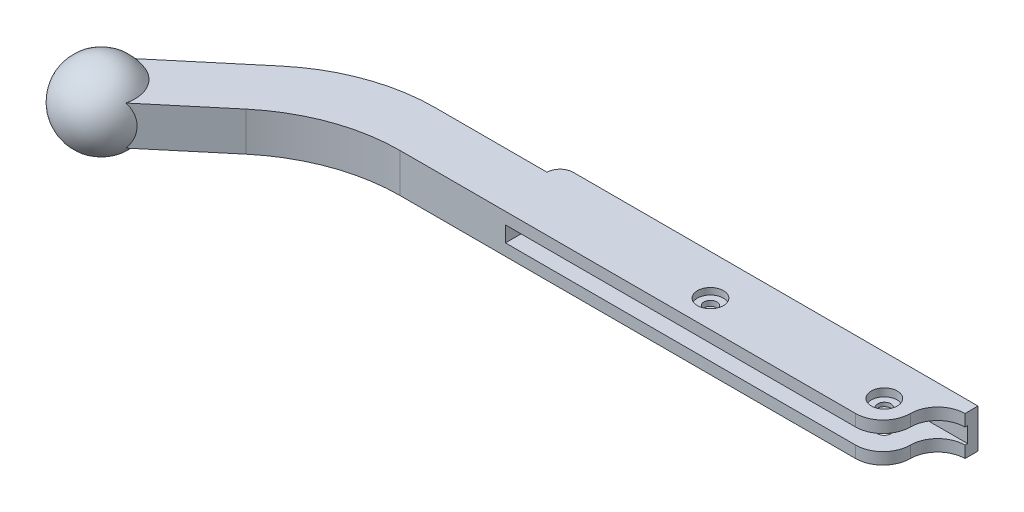
ISO-10303-21;
HEADER;
FILE_DESCRIPTION(('STEP AP214'),'2;1');
FILE_NAME('part.step','',(''),(''),'','','');
FILE_SCHEMA(('AUTOMOTIVE_DESIGN { 1 0 10303 214 1 1 1 1 }'));
ENDSEC;
DATA;
#1=APPLICATION_CONTEXT('core data for automotive mechanical design processes');
#2=APPLICATION_PROTOCOL_DEFINITION('international standard','automotive_design',2000,#1);
#3=PRODUCT_CONTEXT('',#1,'mechanical');
#4=PRODUCT('Part','Part','',(#3));
#5=PRODUCT_RELATED_PRODUCT_CATEGORY('part','',(#4));
#6=PRODUCT_DEFINITION_FORMATION('','',#4);
#7=PRODUCT_DEFINITION_CONTEXT('part definition',#1,'design');
#8=PRODUCT_DEFINITION('design','',#6,#7);
#9=PRODUCT_DEFINITION_SHAPE('','',#8);
#10=(LENGTH_UNIT() NAMED_UNIT(*) SI_UNIT(.MILLI.,.METRE.));
#11=(NAMED_UNIT(*) PLANE_ANGLE_UNIT() SI_UNIT($,.RADIAN.));
#12=(NAMED_UNIT(*) SI_UNIT($,.STERADIAN.) SOLID_ANGLE_UNIT());
#13=UNCERTAINTY_MEASURE_WITH_UNIT(LENGTH_MEASURE(1.E-05),#10,'distance_accuracy_value','');
#14=(GEOMETRIC_REPRESENTATION_CONTEXT(3) GLOBAL_UNCERTAINTY_ASSIGNED_CONTEXT((#13)) GLOBAL_UNIT_ASSIGNED_CONTEXT((#10,
#11,#12)) REPRESENTATION_CONTEXT('',''));
#15=CARTESIAN_POINT('',(0.,0.,0.));
#16=DIRECTION('',(0.,0.,1.));
#17=DIRECTION('',(1.,0.,0.));
#18=AXIS2_PLACEMENT_3D('',#15,#16,#17);
#19=CARTESIAN_POINT('',(52.9707846410685,15.,-18.1552587646077));
#20=DIRECTION('',(-1.,0.,0.));
#21=DIRECTION('',(0.,0.,1.));
#22=AXIS2_PLACEMENT_3D('',#19,#20,#21);
#23=PLANE('',#22);
#24=DIRECTION('',(0.,0.,-1.));
#25=VECTOR('',#24,1.);
#26=CARTESIAN_POINT('',(52.9707846410685,4.5,-18.1552587646077));
#27=LINE('',#26,#25);
#28=CARTESIAN_POINT('',(52.9707846410685,4.5,-13.1552587646077));
#29=VERTEX_POINT('',#28);
#30=CARTESIAN_POINT('',(52.9707846410685,4.5,-14.1552587646077));
#31=VERTEX_POINT('',#30);
#32=EDGE_CURVE('E179',#29,#31,#27,.T.);
#33=ORIENTED_EDGE('',*,*,#32,.F.);
#34=DIRECTION('',(0.,-1.,0.));
#35=VECTOR('',#34,1.);
#36=CARTESIAN_POINT('',(52.9707846410685,15.,-13.1552587646077));
#37=LINE('',#36,#35);
#38=CARTESIAN_POINT('',(52.9707846410685,0.,-13.1552587646077));
#39=VERTEX_POINT('',#38);
#40=EDGE_CURVE('E224',#29,#39,#37,.T.);
#41=ORIENTED_EDGE('',*,*,#40,.T.);
#42=DIRECTION('',(0.,0.,1.));
#43=VECTOR('',#42,1.);
#44=CARTESIAN_POINT('',(52.9707846410685,0.,-18.1552587646077));
#45=LINE('',#44,#43);
#46=CARTESIAN_POINT('',(52.9707846410685,0.,-18.1552587646077));
#47=VERTEX_POINT('',#46);
#48=EDGE_CURVE('E233',#47,#39,#45,.T.);
#49=ORIENTED_EDGE('',*,*,#48,.F.);
#50=DIRECTION('',(0.,-1.,0.));
#51=VECTOR('',#50,1.);
#52=CARTESIAN_POINT('',(52.9707846410685,15.,-18.1552587646077));
#53=LINE('',#52,#51);
#54=CARTESIAN_POINT('',(52.9707846410685,15.,-18.1552587646077));
#55=VERTEX_POINT('',#54);
#56=EDGE_CURVE('E227',#55,#47,#53,.T.);
#57=ORIENTED_EDGE('',*,*,#56,.F.);
#58=DIRECTION('',(0.,0.,1.));
#59=VECTOR('',#58,1.);
#60=CARTESIAN_POINT('',(52.9707846410685,15.,-18.1552587646077));
#61=LINE('',#60,#59);
#62=CARTESIAN_POINT('',(52.9707846410685,15.,-13.1552587646077));
#63=VERTEX_POINT('',#62);
#64=EDGE_CURVE('E238',#55,#63,#61,.T.);
#65=ORIENTED_EDGE('',*,*,#64,.T.);
#66=CARTESIAN_POINT('',(52.9707846410685,10.5,-13.1552587646077));
#67=VERTEX_POINT('',#66);
#68=EDGE_CURVE('E228',#63,#67,#37,.T.);
#69=ORIENTED_EDGE('',*,*,#68,.T.);
#70=DIRECTION('',(0.,0.,1.));
#71=VECTOR('',#70,1.);
#72=CARTESIAN_POINT('',(52.9707846410685,10.5,-18.1552587646077));
#73=LINE('',#72,#71);
#74=CARTESIAN_POINT('',(52.9707846410685,10.5,-14.1552587646077));
#75=VERTEX_POINT('',#74);
#76=EDGE_CURVE('E182',#75,#67,#73,.T.);
#77=ORIENTED_EDGE('',*,*,#76,.F.);
#78=DIRECTION('',(0.,1.,0.));
#79=VECTOR('',#78,1.);
#80=CARTESIAN_POINT('',(52.9707846410685,15.,-14.1552587646077));
#81=LINE('',#80,#79);
#82=EDGE_CURVE('E11',#31,#75,#81,.T.);
#83=ORIENTED_EDGE('',*,*,#82,.F.);
#84=EDGE_LOOP('',(#33,#41,#49,#57,#65,#69,#77,#83));
#85=FACE_BOUND('',#84,.T.);
#86=ADVANCED_FACE('F38',(#85),#23,.F.);
#87=CARTESIAN_POINT('',(-34.2955347589315,-5.,-2.65525876460767));
#88=DIRECTION('',(0.,1.,0.));
#89=DIRECTION('',(0.,0.,1.));
#90=AXIS2_PLACEMENT_3D('',#87,#88,#89);
#91=CYLINDRICAL_SURFACE('',#90,5.);
#92=CARTESIAN_POINT('',(-34.2955347589315,15.,-2.65525876460767));
#93=DIRECTION('',(0.,1.,0.));
#94=DIRECTION('',(0.,0.,1.));
#95=AXIS2_PLACEMENT_3D('',#92,#93,#94);
#96=CIRCLE('',#95,5.);
#97=CARTESIAN_POINT('',(-34.2955347589315,15.,2.34474123539233));
#98=VERTEX_POINT('',#97);
#99=EDGE_CURVE('E251',#98,#98,#96,.T.);
#100=ORIENTED_EDGE('',*,*,#99,.T.);
#101=EDGE_LOOP('',(#100));
#102=FACE_BOUND('',#101,.T.);
#103=CARTESIAN_POINT('',(-34.2955347589315,12.5,-2.65525876460767));
#104=DIRECTION('',(0.,-1.,0.));
#105=DIRECTION('',(0.,0.,-1.));
#106=AXIS2_PLACEMENT_3D('',#103,#104,#105);
#107=CIRCLE('',#106,5.);
#108=CARTESIAN_POINT('',(-34.2955347589315,12.5,-7.65525876460768));
#109=VERTEX_POINT('',#108);
#110=EDGE_CURVE('E295',#109,#109,#107,.F.);
#111=ORIENTED_EDGE('',*,*,#110,.F.);
#112=EDGE_LOOP('',(#111));
#113=FACE_BOUND('',#112,.T.);
#114=ADVANCED_FACE('F403',(#102,#113),#91,.F.);
#115=CARTESIAN_POINT('',(-34.2955347589315,0.,-2.65525876460767));
#116=DIRECTION('',(0.,1.,0.));
#117=DIRECTION('',(0.,0.,1.));
#118=AXIS2_PLACEMENT_3D('',#115,#116,#117);
#119=CIRCLE('',#118,5.);
#120=CARTESIAN_POINT('',(-34.2955347589315,0.,2.34474123539233));
#121=VERTEX_POINT('',#120);
#122=EDGE_CURVE('E254',#121,#121,#119,.T.);
#123=ORIENTED_EDGE('',*,*,#122,.F.);
#124=EDGE_LOOP('',(#123));
#125=FACE_BOUND('',#124,.T.);
#126=CARTESIAN_POINT('',(-34.2955347589315,2.5,-2.65525876460767));
#127=DIRECTION('',(0.,1.,0.));
#128=DIRECTION('',(0.,0.,1.));
#129=AXIS2_PLACEMENT_3D('',#126,#127,#128);
#130=CIRCLE('',#129,5.);
#131=CARTESIAN_POINT('',(-34.2955347589315,2.5,2.34474123539233));
#132=VERTEX_POINT('',#131);
#133=EDGE_CURVE('E289',#132,#132,#130,.F.);
#134=ORIENTED_EDGE('',*,*,#133,.F.);
#135=EDGE_LOOP('',(#134));
#136=FACE_BOUND('',#135,.T.);
#137=ADVANCED_FACE('F409',(#125,#136),#91,.F.);
#138=CARTESIAN_POINT('',(-107.529215358932,15.,7.84474123539233));
#139=DIRECTION('',(0.,0.,-1.));
#140=DIRECTION('',(-1.,0.,0.));
#141=AXIS2_PLACEMENT_3D('',#138,#139,#140);
#142=PLANE('',#141);
#143=DIRECTION('',(1.,0.,0.));
#144=VECTOR('',#143,1.);
#145=CARTESIAN_POINT('',(-107.529215358932,15.,7.84474123539233));
#146=LINE('',#145,#144);
#147=CARTESIAN_POINT('',(-142.961224545963,15.,7.84474123539233));
#148=VERTEX_POINT('',#147);
#149=CARTESIAN_POINT('',(31.9707846410685,15.,7.84474123539233));
#150=VERTEX_POINT('',#149);
#151=EDGE_CURVE('E287',#148,#150,#146,.T.);
#152=ORIENTED_EDGE('',*,*,#151,.F.);
#153=DIRECTION('',(0.,1.,0.));
#154=VECTOR('',#153,1.);
#155=CARTESIAN_POINT('',(-142.961224545963,15.,7.84474123539233));
#156=LINE('',#155,#154);
#157=CARTESIAN_POINT('',(-142.961224545963,0.,7.84474123539233));
#158=VERTEX_POINT('',#157);
#159=EDGE_CURVE('E337',#148,#158,#156,.F.);
#160=ORIENTED_EDGE('',*,*,#159,.T.);
#161=DIRECTION('',(1.,0.,0.));
#162=VECTOR('',#161,1.);
#163=CARTESIAN_POINT('',(-107.529215358932,0.,7.84474123539233));
#164=LINE('',#163,#162);
#165=CARTESIAN_POINT('',(31.9707846410685,0.,7.84474123539233));
#166=VERTEX_POINT('',#165);
#167=EDGE_CURVE('E285',#158,#166,#164,.T.);
#168=ORIENTED_EDGE('',*,*,#167,.T.);
#169=DIRECTION('',(0.,-1.,0.));
#170=VECTOR('',#169,1.);
#171=CARTESIAN_POINT('',(31.9707846410685,15.,7.84474123539233));
#172=LINE('',#171,#170);
#173=CARTESIAN_POINT('',(31.9707846410685,4.5,7.84474123539233));
#174=VERTEX_POINT('',#173);
#175=EDGE_CURVE('E313',#166,#174,#172,.F.);
#176=ORIENTED_EDGE('',*,*,#175,.T.);
#177=DIRECTION('',(1.,0.,0.));
#178=VECTOR('',#177,1.);
#179=CARTESIAN_POINT('',(-102.529215358932,4.5,7.84474123539233));
#180=LINE('',#179,#178);
#181=CARTESIAN_POINT('',(-102.529215358932,4.5,7.84474123539233));
#182=VERTEX_POINT('',#181);
#183=EDGE_CURVE('E281',#182,#174,#180,.T.);
#184=ORIENTED_EDGE('',*,*,#183,.F.);
#185=DIRECTION('',(0.,-1.,0.));
#186=VECTOR('',#185,1.);
#187=CARTESIAN_POINT('',(-102.529215358932,10.5,7.84474123539233));
#188=LINE('',#187,#186);
#189=CARTESIAN_POINT('',(-102.529215358932,10.5,7.84474123539233));
#190=VERTEX_POINT('',#189);
#191=EDGE_CURVE('E169',#190,#182,#188,.T.);
#192=ORIENTED_EDGE('',*,*,#191,.F.);
#193=DIRECTION('',(1.,0.,0.));
#194=VECTOR('',#193,1.);
#195=CARTESIAN_POINT('',(-102.529215358932,10.5,7.84474123539233));
#196=LINE('',#195,#194);
#197=CARTESIAN_POINT('',(31.9707846410685,10.5,7.84474123539233));
#198=VERTEX_POINT('',#197);
#199=EDGE_CURVE('E282',#190,#198,#196,.T.);
#200=ORIENTED_EDGE('',*,*,#199,.T.);
#201=DIRECTION('',(0.,-1.,0.));
#202=VECTOR('',#201,1.);
#203=CARTESIAN_POINT('',(31.9707846410685,15.,7.84474123539233));
#204=LINE('',#203,#202);
#205=EDGE_CURVE('E310',#198,#150,#204,.F.);
#206=ORIENTED_EDGE('',*,*,#205,.T.);
#207=EDGE_LOOP('',(#152,#160,#168,#176,#184,#192,#200,#206));
#208=FACE_BOUND('',#207,.T.);
#209=ADVANCED_FACE('F365',(#208),#142,.F.);
#210=CARTESIAN_POINT('',(0.,15.,0.));
#211=DIRECTION('',(0.,1.,0.));
#212=DIRECTION('',(0.,0.,1.));
#213=AXIS2_PLACEMENT_3D('',#210,#211,#212);
#214=PLANE('',#213);
#215=ORIENTED_EDGE('',*,*,#99,.F.);
#216=EDGE_LOOP('',(#215));
#217=FACE_BOUND('',#216,.T.);
#218=CARTESIAN_POINT('',(32.4707846410684,15.,-2.65525876460767));
#219=DIRECTION('',(0.,1.,0.));
#220=DIRECTION('',(0.,0.,1.));
#221=AXIS2_PLACEMENT_3D('',#218,#219,#220);
#222=CIRCLE('',#221,5.);
#223=CARTESIAN_POINT('',(32.4707846410684,15.,2.34474123539233));
#224=VERTEX_POINT('',#223);
#225=EDGE_CURVE('E271',#224,#224,#222,.T.);
#226=ORIENTED_EDGE('',*,*,#225,.F.);
#227=EDGE_LOOP('',(#226));
#228=FACE_BOUND('',#227,.T.);
#229=DIRECTION('',(-1.,0.,0.));
#230=VECTOR('',#229,1.);
#231=CARTESIAN_POINT('',(-107.529215358932,15.,-13.1552587646077));
#232=LINE('',#231,#230);
#233=CARTESIAN_POINT('',(-107.529215358932,15.,-13.1552587646077));
#234=VERTEX_POINT('',#233);
#235=CARTESIAN_POINT('',(-150.604599465553,15.,-13.1552587646077));
#236=VERTEX_POINT('',#235);
#237=EDGE_CURVE('E203',#234,#236,#232,.T.);
#238=ORIENTED_EDGE('',*,*,#237,.T.);
#239=CARTESIAN_POINT('',(-150.604599465553,15.,54.3447412353923));
#240=DIRECTION('',(0.,1.,0.));
#241=DIRECTION('',(0.,0.,1.));
#242=AXIS2_PLACEMENT_3D('',#239,#240,#241);
#243=CIRCLE('',#242,67.5);
#244=CARTESIAN_POINT('',(-193.992763119394,15.,2.63674132486125));
#245=VERTEX_POINT('',#244);
#246=EDGE_CURVE('E61',#236,#245,#243,.T.);
#247=ORIENTED_EDGE('',*,*,#246,.T.);
#248=DIRECTION('',(-0.766044443118979,0.,0.642787609686538));
#249=VECTOR('',#248,1.);
#250=CARTESIAN_POINT('',(-230.820643965082,15.,33.539002559519));
#251=LINE('',#250,#249);
#252=CARTESIAN_POINT('',(-224.961530619468,15.,28.6226227121879));
#253=VERTEX_POINT('',#252);
#254=EDGE_CURVE('E215',#245,#253,#251,.T.);
#255=ORIENTED_EDGE('',*,*,#254,.T.);
#256=CARTESIAN_POINT('',(-224.071374063374,15.,41.5824692122682));
#257=DIRECTION('',(0.,-1.,0.));
#258=DIRECTION('',(0.,0.,-1.));
#259=AXIS2_PLACEMENT_3D('',#256,#257,#258);
#260=CIRCLE('',#259,12.9903810567666);
#261=CARTESIAN_POINT('',(-211.462990816051,15.,44.7095560176864));
#262=VERTEX_POINT('',#261);
#263=EDGE_CURVE('E221',#262,#253,#260,.F.);
#264=ORIENTED_EDGE('',*,*,#263,.F.);
#265=DIRECTION('',(0.766044443118977,0.,-0.64278760968654));
#266=VECTOR('',#265,1.);
#267=CARTESIAN_POINT('',(-167.529215358932,15.,7.84474123539233));
#268=LINE('',#267,#266);
#269=CARTESIAN_POINT('',(-186.349388199804,15.,23.6367413248614));
#270=VERTEX_POINT('',#269);
#271=EDGE_CURVE('E208',#262,#270,#268,.T.);
#272=ORIENTED_EDGE('',*,*,#271,.T.);
#273=CARTESIAN_POINT('',(-142.961224545963,15.,75.3447412353923));
#274=DIRECTION('',(0.,1.,0.));
#275=DIRECTION('',(0.,0.,1.));
#276=AXIS2_PLACEMENT_3D('',#273,#274,#275);
#277=CIRCLE('',#276,67.5);
#278=EDGE_CURVE('E346',#270,#148,#277,.F.);
#279=ORIENTED_EDGE('',*,*,#278,.T.);
#280=ORIENTED_EDGE('',*,*,#151,.T.);
#281=CARTESIAN_POINT('',(31.9707846410685,15.,-2.65525876460767));
#282=DIRECTION('',(0.,1.,0.));
#283=DIRECTION('',(0.,0.,1.));
#284=AXIS2_PLACEMENT_3D('',#281,#282,#283);
#285=CIRCLE('',#284,10.5);
#286=CARTESIAN_POINT('',(42.4707846410685,15.,-2.65525876460768));
#287=VERTEX_POINT('',#286);
#288=EDGE_CURVE('E320',#150,#287,#285,.T.);
#289=ORIENTED_EDGE('',*,*,#288,.T.);
#290=CARTESIAN_POINT('',(52.9707846410685,15.,-2.65525876460767));
#291=DIRECTION('',(0.,1.,0.));
#292=DIRECTION('',(0.,0.,1.));
#293=AXIS2_PLACEMENT_3D('',#290,#291,#292);
#294=CIRCLE('',#293,10.5);
#295=EDGE_CURVE('E328',#287,#63,#294,.F.);
#296=ORIENTED_EDGE('',*,*,#295,.T.);
#297=ORIENTED_EDGE('',*,*,#64,.F.);
#298=DIRECTION('',(1.,0.,0.));
#299=VECTOR('',#298,1.);
#300=CARTESIAN_POINT('',(-107.529215358932,15.,-18.1552587646077));
#301=LINE('',#300,#299);
#302=CARTESIAN_POINT('',(-102.529215358932,15.,-18.1552587646077));
#303=VERTEX_POINT('',#302);
#304=EDGE_CURVE('E225',#303,#55,#301,.T.);
#305=ORIENTED_EDGE('',*,*,#304,.F.);
#306=CARTESIAN_POINT('',(-102.529215358932,15.,-13.1552587646077));
#307=DIRECTION('',(0.,1.,0.));
#308=DIRECTION('',(0.,0.,1.));
#309=AXIS2_PLACEMENT_3D('',#306,#307,#308);
#310=CIRCLE('',#309,5.);
#311=EDGE_CURVE('E303',#303,#234,#310,.T.);
#312=ORIENTED_EDGE('',*,*,#311,.T.);
#313=EDGE_LOOP('',(#238,#247,#255,#264,#272,#279,#280,#289,#296,#297,#305,#312));
#314=FACE_BOUND('',#313,.T.);
#315=ADVANCED_FACE('F362',(#217,#228,#314),#214,.T.);
#316=CARTESIAN_POINT('',(0.,0.,0.));
#317=DIRECTION('',(0.,1.,0.));
#318=DIRECTION('',(0.,0.,1.));
#319=AXIS2_PLACEMENT_3D('',#316,#317,#318);
#320=PLANE('',#319);
#321=ORIENTED_EDGE('',*,*,#122,.T.);
#322=EDGE_LOOP('',(#321));
#323=FACE_BOUND('',#322,.T.);
#324=CARTESIAN_POINT('',(32.4707846410684,0.,-2.65525876460767));
#325=DIRECTION('',(0.,-1.,0.));
#326=DIRECTION('',(0.,0.,-1.));
#327=AXIS2_PLACEMENT_3D('',#324,#325,#326);
#328=CIRCLE('',#327,5.);
#329=CARTESIAN_POINT('',(32.4707846410684,0.,-7.65525876460768));
#330=VERTEX_POINT('',#329);
#331=EDGE_CURVE('E267',#330,#330,#328,.T.);
#332=ORIENTED_EDGE('',*,*,#331,.F.);
#333=EDGE_LOOP('',(#332));
#334=FACE_BOUND('',#333,.T.);
#335=DIRECTION('',(-0.766044443118979,0.,0.642787609686538));
#336=VECTOR('',#335,1.);
#337=CARTESIAN_POINT('',(-230.820643965082,0.,33.539002559519));
#338=LINE('',#337,#336);
#339=CARTESIAN_POINT('',(-193.992763119394,0.,2.63674132486125));
#340=VERTEX_POINT('',#339);
#341=CARTESIAN_POINT('',(-224.961530619468,0.,28.6226227121879));
#342=VERTEX_POINT('',#341);
#343=EDGE_CURVE('E207',#340,#342,#338,.T.);
#344=ORIENTED_EDGE('',*,*,#343,.F.);
#345=CARTESIAN_POINT('',(-150.604599465553,0.,54.3447412353923));
#346=DIRECTION('',(0.,1.,0.));
#347=DIRECTION('',(0.,0.,1.));
#348=AXIS2_PLACEMENT_3D('',#345,#346,#347);
#349=CIRCLE('',#348,67.5);
#350=CARTESIAN_POINT('',(-150.604599465553,0.,-13.1552587646077));
#351=VERTEX_POINT('',#350);
#352=EDGE_CURVE('E344',#340,#351,#349,.F.);
#353=ORIENTED_EDGE('',*,*,#352,.T.);
#354=DIRECTION('',(-1.,0.,0.));
#355=VECTOR('',#354,1.);
#356=CARTESIAN_POINT('',(-107.529215358932,0.,-13.1552587646077));
#357=LINE('',#356,#355);
#358=CARTESIAN_POINT('',(-107.529215358932,0.,-13.1552587646077));
#359=VERTEX_POINT('',#358);
#360=EDGE_CURVE('E204',#359,#351,#357,.T.);
#361=ORIENTED_EDGE('',*,*,#360,.F.);
#362=CARTESIAN_POINT('',(-102.529215358932,0.,-13.1552587646077));
#363=DIRECTION('',(0.,1.,0.));
#364=DIRECTION('',(0.,0.,1.));
#365=AXIS2_PLACEMENT_3D('',#362,#363,#364);
#366=CIRCLE('',#365,5.);
#367=CARTESIAN_POINT('',(-102.529215358932,0.,-18.1552587646077));
#368=VERTEX_POINT('',#367);
#369=EDGE_CURVE('E305',#359,#368,#366,.F.);
#370=ORIENTED_EDGE('',*,*,#369,.T.);
#371=DIRECTION('',(-1.,0.,0.));
#372=VECTOR('',#371,1.);
#373=CARTESIAN_POINT('',(-107.529215358932,0.,-18.1552587646077));
#374=LINE('',#373,#372);
#375=EDGE_CURVE('E230',#47,#368,#374,.T.);
#376=ORIENTED_EDGE('',*,*,#375,.F.);
#377=ORIENTED_EDGE('',*,*,#48,.T.);
#378=CARTESIAN_POINT('',(52.9707846410685,0.,-2.65525876460767));
#379=DIRECTION('',(0.,1.,0.));
#380=DIRECTION('',(0.,0.,1.));
#381=AXIS2_PLACEMENT_3D('',#378,#379,#380);
#382=CIRCLE('',#381,10.5);
#383=CARTESIAN_POINT('',(42.4707846410685,0.,-2.65525876460768));
#384=VERTEX_POINT('',#383);
#385=EDGE_CURVE('E322',#39,#384,#382,.T.);
#386=ORIENTED_EDGE('',*,*,#385,.T.);
#387=CARTESIAN_POINT('',(31.9707846410685,0.,-2.65525876460767));
#388=DIRECTION('',(0.,1.,0.));
#389=DIRECTION('',(0.,0.,1.));
#390=AXIS2_PLACEMENT_3D('',#387,#388,#389);
#391=CIRCLE('',#390,10.5);
#392=EDGE_CURVE('E307',#384,#166,#391,.F.);
#393=ORIENTED_EDGE('',*,*,#392,.T.);
#394=ORIENTED_EDGE('',*,*,#167,.F.);
#395=CARTESIAN_POINT('',(-142.961224545963,0.,75.3447412353923));
#396=DIRECTION('',(0.,1.,0.));
#397=DIRECTION('',(0.,0.,1.));
#398=AXIS2_PLACEMENT_3D('',#395,#396,#397);
#399=CIRCLE('',#398,67.5);
#400=CARTESIAN_POINT('',(-186.349388199804,0.,23.6367413248614));
#401=VERTEX_POINT('',#400);
#402=EDGE_CURVE('E46',#158,#401,#399,.T.);
#403=ORIENTED_EDGE('',*,*,#402,.T.);
#404=DIRECTION('',(0.766044443118977,0.,-0.64278760968654));
#405=VECTOR('',#404,1.);
#406=CARTESIAN_POINT('',(-167.529215358932,0.,7.84474123539233));
#407=LINE('',#406,#405);
#408=CARTESIAN_POINT('',(-211.462990816051,0.,44.7095560176864));
#409=VERTEX_POINT('',#408);
#410=EDGE_CURVE('E210',#409,#401,#407,.T.);
#411=ORIENTED_EDGE('',*,*,#410,.F.);
#412=CARTESIAN_POINT('',(-224.071374063374,0.,41.5824692122682));
#413=DIRECTION('',(0.,-1.,0.));
#414=DIRECTION('',(0.,0.,-1.));
#415=AXIS2_PLACEMENT_3D('',#412,#413,#414);
#416=CIRCLE('',#415,12.9903810567666);
#417=EDGE_CURVE('E200',#409,#342,#416,.F.);
#418=ORIENTED_EDGE('',*,*,#417,.T.);
#419=EDGE_LOOP('',(#344,#353,#361,#370,#376,#377,#386,#393,#394,#403,#411,#418));
#420=FACE_BOUND('',#419,.T.);
#421=ADVANCED_FACE('F351',(#323,#334,#420),#320,.F.);
#422=CARTESIAN_POINT('',(-102.529215358932,10.5,7.84474123539233));
#423=DIRECTION('',(0.,1.,0.));
#424=DIRECTION('',(0.,0.,1.));
#425=AXIS2_PLACEMENT_3D('',#422,#423,#424);
#426=PLANE('',#425);
#427=CARTESIAN_POINT('',(-34.2955347589315,10.5,-2.65525876460767));
#428=DIRECTION('',(0.,1.,0.));
#429=DIRECTION('',(0.,0.,1.));
#430=AXIS2_PLACEMENT_3D('',#427,#428,#429);
#431=CIRCLE('',#430,2.5);
#432=CARTESIAN_POINT('',(-34.2955347589315,10.5,-0.155258764607672));
#433=VERTEX_POINT('',#432);
#434=EDGE_CURVE('E248',#433,#433,#431,.T.);
#435=ORIENTED_EDGE('',*,*,#434,.T.);
#436=EDGE_LOOP('',(#435));
#437=FACE_BOUND('',#436,.T.);
#438=CARTESIAN_POINT('',(32.4707846410684,10.5,-2.65525876460767));
#439=DIRECTION('',(0.,1.,0.));
#440=DIRECTION('',(0.,0.,1.));
#441=AXIS2_PLACEMENT_3D('',#438,#439,#440);
#442=CIRCLE('',#441,2.5);
#443=CARTESIAN_POINT('',(32.4707846410684,10.5,-0.155258764607676));
#444=VERTEX_POINT('',#443);
#445=EDGE_CURVE('E264',#444,#444,#442,.T.);
#446=ORIENTED_EDGE('',*,*,#445,.T.);
#447=EDGE_LOOP('',(#446));
#448=FACE_BOUND('',#447,.T.);
#449=DIRECTION('',(0.,0.,1.));
#450=VECTOR('',#449,1.);
#451=CARTESIAN_POINT('',(-102.529215358932,10.5,7.84474123539233));
#452=LINE('',#451,#450);
#453=CARTESIAN_POINT('',(-102.529215358932,10.5,-14.1552587646077));
#454=VERTEX_POINT('',#453);
#455=EDGE_CURVE('E173',#454,#190,#452,.T.);
#456=ORIENTED_EDGE('',*,*,#455,.F.);
#457=DIRECTION('',(-1.,0.,0.));
#458=VECTOR('',#457,1.);
#459=CARTESIAN_POINT('',(97.4707846410685,10.5,-14.1552587646077));
#460=LINE('',#459,#458);
#461=EDGE_CURVE('E183',#75,#454,#460,.T.);
#462=ORIENTED_EDGE('',*,*,#461,.F.);
#463=ORIENTED_EDGE('',*,*,#76,.T.);
#464=CARTESIAN_POINT('',(52.9707846410685,10.5,-2.65525876460767));
#465=DIRECTION('',(0.,1.,0.));
#466=DIRECTION('',(0.,0.,1.));
#467=AXIS2_PLACEMENT_3D('',#464,#465,#466);
#468=CIRCLE('',#467,10.5);
#469=CARTESIAN_POINT('',(42.4707846410685,10.5,-2.65525876460767));
#470=VERTEX_POINT('',#469);
#471=EDGE_CURVE('E326',#67,#470,#468,.T.);
#472=ORIENTED_EDGE('',*,*,#471,.T.);
#473=CARTESIAN_POINT('',(31.9707846410685,10.5,-2.65525876460767));
#474=DIRECTION('',(0.,1.,0.));
#475=DIRECTION('',(0.,0.,1.));
#476=AXIS2_PLACEMENT_3D('',#473,#474,#475);
#477=CIRCLE('',#476,10.5);
#478=EDGE_CURVE('E318',#470,#198,#477,.F.);
#479=ORIENTED_EDGE('',*,*,#478,.T.);
#480=ORIENTED_EDGE('',*,*,#199,.F.);
#481=EDGE_LOOP('',(#456,#462,#463,#472,#479,#480));
#482=FACE_BOUND('',#481,.T.);
#483=ADVANCED_FACE('F453',(#437,#448,#482),#426,.F.);
#484=CARTESIAN_POINT('',(-102.529215358932,4.5,7.84474123539233));
#485=DIRECTION('',(0.,-1.,0.));
#486=DIRECTION('',(0.,0.,-1.));
#487=AXIS2_PLACEMENT_3D('',#484,#485,#486);
#488=PLANE('',#487);
#489=CARTESIAN_POINT('',(-34.2955347589315,4.5,-2.65525876460767));
#490=DIRECTION('',(0.,-1.,0.));
#491=DIRECTION('',(0.,0.,-1.));
#492=AXIS2_PLACEMENT_3D('',#489,#490,#491);
#493=CIRCLE('',#492,2.5);
#494=CARTESIAN_POINT('',(-34.2955347589315,4.5,-5.15525876460768));
#495=VERTEX_POINT('',#494);
#496=EDGE_CURVE('E245',#495,#495,#493,.T.);
#497=ORIENTED_EDGE('',*,*,#496,.T.);
#498=EDGE_LOOP('',(#497));
#499=FACE_BOUND('',#498,.T.);
#500=CARTESIAN_POINT('',(32.4707846410684,4.5,-2.65525876460767));
#501=DIRECTION('',(0.,-1.,0.));
#502=DIRECTION('',(0.,0.,-1.));
#503=AXIS2_PLACEMENT_3D('',#500,#501,#502);
#504=CIRCLE('',#503,2.5);
#505=CARTESIAN_POINT('',(32.4707846410684,4.5,-5.15525876460767));
#506=VERTEX_POINT('',#505);
#507=EDGE_CURVE('E261',#506,#506,#504,.T.);
#508=ORIENTED_EDGE('',*,*,#507,.T.);
#509=EDGE_LOOP('',(#508));
#510=FACE_BOUND('',#509,.T.);
#511=ORIENTED_EDGE('',*,*,#183,.T.);
#512=CARTESIAN_POINT('',(31.9707846410685,4.5,-2.65525876460767));
#513=DIRECTION('',(0.,-1.,0.));
#514=DIRECTION('',(0.,0.,-1.));
#515=AXIS2_PLACEMENT_3D('',#512,#513,#514);
#516=CIRCLE('',#515,10.5);
#517=CARTESIAN_POINT('',(42.4707846410685,4.5,-2.65525876460767));
#518=VERTEX_POINT('',#517);
#519=EDGE_CURVE('E316',#174,#518,#516,.F.);
#520=ORIENTED_EDGE('',*,*,#519,.T.);
#521=CARTESIAN_POINT('',(52.9707846410685,4.5,-2.65525876460767));
#522=DIRECTION('',(0.,-1.,0.));
#523=DIRECTION('',(0.,0.,-1.));
#524=AXIS2_PLACEMENT_3D('',#521,#522,#523);
#525=CIRCLE('',#524,10.5);
#526=EDGE_CURVE('E324',#518,#29,#525,.T.);
#527=ORIENTED_EDGE('',*,*,#526,.T.);
#528=ORIENTED_EDGE('',*,*,#32,.T.);
#529=DIRECTION('',(-1.,0.,0.));
#530=VECTOR('',#529,1.);
#531=CARTESIAN_POINT('',(97.4707846410685,4.5,-14.1552587646077));
#532=LINE('',#531,#530);
#533=CARTESIAN_POINT('',(-102.529215358932,4.5,-14.1552587646077));
#534=VERTEX_POINT('',#533);
#535=EDGE_CURVE('E176',#31,#534,#532,.T.);
#536=ORIENTED_EDGE('',*,*,#535,.T.);
#537=DIRECTION('',(0.,0.,-1.));
#538=VECTOR('',#537,1.);
#539=CARTESIAN_POINT('',(-102.529215358932,4.5,7.84474123539233));
#540=LINE('',#539,#538);
#541=EDGE_CURVE('E162',#182,#534,#540,.T.);
#542=ORIENTED_EDGE('',*,*,#541,.F.);
#543=EDGE_LOOP('',(#511,#520,#527,#528,#536,#542));
#544=FACE_BOUND('',#543,.T.);
#545=ADVANCED_FACE('F177',(#499,#510,#544),#488,.F.);
#546=CARTESIAN_POINT('',(-102.529215358932,0.,0.));
#547=DIRECTION('',(1.,0.,0.));
#548=DIRECTION('',(0.,0.,-1.));
#549=AXIS2_PLACEMENT_3D('',#546,#547,#548);
#550=PLANE('',#549);
#551=ORIENTED_EDGE('',*,*,#191,.T.);
#552=ORIENTED_EDGE('',*,*,#541,.T.);
#553=DIRECTION('',(0.,1.,0.));
#554=VECTOR('',#553,1.);
#555=CARTESIAN_POINT('',(-102.529215358932,10.5,-14.1552587646077));
#556=LINE('',#555,#554);
#557=EDGE_CURVE('E167',#534,#454,#556,.T.);
#558=ORIENTED_EDGE('',*,*,#557,.T.);
#559=ORIENTED_EDGE('',*,*,#455,.T.);
#560=EDGE_LOOP('',(#551,#552,#558,#559));
#561=FACE_BOUND('',#560,.T.);
#562=ADVANCED_FACE('F164',(#561),#550,.T.);
#563=CARTESIAN_POINT('',(32.4707846410684,12.,-2.65525876460767));
#564=DIRECTION('',(0.,1.,0.));
#565=DIRECTION('',(0.,0.,1.));
#566=AXIS2_PLACEMENT_3D('',#563,#564,#565);
#567=CYLINDRICAL_SURFACE('',#566,5.);
#568=CARTESIAN_POINT('',(32.4707846410684,12.,-2.65525876460767));
#569=DIRECTION('',(0.,1.,0.));
#570=DIRECTION('',(0.,0.,1.));
#571=AXIS2_PLACEMENT_3D('',#568,#569,#570);
#572=CIRCLE('',#571,5.);
#573=CARTESIAN_POINT('',(32.4707846410684,12.,2.34474123539233));
#574=VERTEX_POINT('',#573);
#575=EDGE_CURVE('E274',#574,#574,#572,.T.);
#576=ORIENTED_EDGE('',*,*,#575,.F.);
#577=EDGE_LOOP('',(#576));
#578=FACE_BOUND('',#577,.T.);
#579=ORIENTED_EDGE('',*,*,#225,.T.);
#580=EDGE_LOOP('',(#579));
#581=FACE_BOUND('',#580,.T.);
#582=ADVANCED_FACE('F446',(#578,#581),#567,.F.);
#583=CARTESIAN_POINT('',(32.4707846410684,12.,-2.65525876460767));
#584=DIRECTION('',(0.,1.,0.));
#585=DIRECTION('',(0.,0.,1.));
#586=AXIS2_PLACEMENT_3D('',#583,#584,#585);
#587=PLANE('',#586);
#588=CARTESIAN_POINT('',(32.4707846410684,12.,-2.65525876460767));
#589=DIRECTION('',(0.,1.,0.));
#590=DIRECTION('',(0.,0.,1.));
#591=AXIS2_PLACEMENT_3D('',#588,#589,#590);
#592=CIRCLE('',#591,2.5);
#593=CARTESIAN_POINT('',(32.4707846410684,12.,-0.155258764607676));
#594=VERTEX_POINT('',#593);
#595=EDGE_CURVE('E260',#594,#594,#592,.T.);
#596=ORIENTED_EDGE('',*,*,#595,.F.);
#597=EDGE_LOOP('',(#596));
#598=FACE_BOUND('',#597,.T.);
#599=ORIENTED_EDGE('',*,*,#575,.T.);
#600=EDGE_LOOP('',(#599));
#601=FACE_BOUND('',#600,.T.);
#602=ADVANCED_FACE('F442',(#598,#601),#587,.T.);
#603=CARTESIAN_POINT('',(32.4707846410684,3.,-2.65525876460767));
#604=DIRECTION('',(0.,-1.,0.));
#605=DIRECTION('',(0.,0.,-1.));
#606=AXIS2_PLACEMENT_3D('',#603,#604,#605);
#607=CYLINDRICAL_SURFACE('',#606,5.);
#608=CARTESIAN_POINT('',(32.4707846410684,3.,-2.65525876460767));
#609=DIRECTION('',(0.,-1.,0.));
#610=DIRECTION('',(0.,0.,-1.));
#611=AXIS2_PLACEMENT_3D('',#608,#609,#610);
#612=CIRCLE('',#611,5.);
#613=CARTESIAN_POINT('',(32.4707846410684,3.,-7.65525876460768));
#614=VERTEX_POINT('',#613);
#615=EDGE_CURVE('E268',#614,#614,#612,.T.);
#616=ORIENTED_EDGE('',*,*,#615,.F.);
#617=EDGE_LOOP('',(#616));
#618=FACE_BOUND('',#617,.T.);
#619=ORIENTED_EDGE('',*,*,#331,.T.);
#620=EDGE_LOOP('',(#619));
#621=FACE_BOUND('',#620,.T.);
#622=ADVANCED_FACE('F438',(#618,#621),#607,.F.);
#623=CARTESIAN_POINT('',(32.4707846410684,3.,-2.65525876460767));
#624=DIRECTION('',(0.,-1.,0.));
#625=DIRECTION('',(0.,0.,-1.));
#626=AXIS2_PLACEMENT_3D('',#623,#624,#625);
#627=PLANE('',#626);
#628=CARTESIAN_POINT('',(32.4707846410684,3.,-2.65525876460767));
#629=DIRECTION('',(0.,-1.,0.));
#630=DIRECTION('',(0.,0.,-1.));
#631=AXIS2_PLACEMENT_3D('',#628,#629,#630);
#632=CIRCLE('',#631,2.5);
#633=CARTESIAN_POINT('',(32.4707846410684,3.,-5.15525876460767));
#634=VERTEX_POINT('',#633);
#635=EDGE_CURVE('E257',#634,#634,#632,.T.);
#636=ORIENTED_EDGE('',*,*,#635,.F.);
#637=EDGE_LOOP('',(#636));
#638=FACE_BOUND('',#637,.T.);
#639=ORIENTED_EDGE('',*,*,#615,.T.);
#640=EDGE_LOOP('',(#639));
#641=FACE_BOUND('',#640,.T.);
#642=ADVANCED_FACE('F434',(#638,#641),#627,.T.);
#643=CARTESIAN_POINT('',(32.4707846410684,23.,-2.65525876460767));
#644=DIRECTION('',(0.,-1.,0.));
#645=DIRECTION('',(0.,0.,-1.));
#646=AXIS2_PLACEMENT_3D('',#643,#644,#645);
#647=CYLINDRICAL_SURFACE('',#646,2.5);
#648=ORIENTED_EDGE('',*,*,#595,.T.);
#649=EDGE_LOOP('',(#648));
#650=FACE_BOUND('',#649,.T.);
#651=ORIENTED_EDGE('',*,*,#445,.F.);
#652=EDGE_LOOP('',(#651));
#653=FACE_BOUND('',#652,.T.);
#654=ADVANCED_FACE('F431',(#650,#653),#647,.F.);
#655=ORIENTED_EDGE('',*,*,#635,.T.);
#656=EDGE_LOOP('',(#655));
#657=FACE_BOUND('',#656,.T.);
#658=ORIENTED_EDGE('',*,*,#507,.F.);
#659=EDGE_LOOP('',(#658));
#660=FACE_BOUND('',#659,.T.);
#661=ADVANCED_FACE('F426',(#657,#660),#647,.F.);
#662=CARTESIAN_POINT('',(-34.2955347589315,2.5,-2.65525876460767));
#663=DIRECTION('',(0.,1.,0.));
#664=DIRECTION('',(0.,0.,1.));
#665=AXIS2_PLACEMENT_3D('',#662,#663,#664);
#666=PLANE('',#665);
#667=CARTESIAN_POINT('',(-34.2955347589315,2.5,-2.65525876460767));
#668=DIRECTION('',(0.,1.,0.));
#669=DIRECTION('',(0.,0.,1.));
#670=AXIS2_PLACEMENT_3D('',#667,#668,#669);
#671=CIRCLE('',#670,2.5);
#672=CARTESIAN_POINT('',(-34.2955347589315,2.5,-0.155258764607672));
#673=VERTEX_POINT('',#672);
#674=EDGE_CURVE('E244',#673,#673,#671,.T.);
#675=ORIENTED_EDGE('',*,*,#674,.T.);
#676=EDGE_LOOP('',(#675));
#677=FACE_BOUND('',#676,.T.);
#678=ORIENTED_EDGE('',*,*,#133,.T.);
#679=EDGE_LOOP('',(#678));
#680=FACE_BOUND('',#679,.T.);
#681=ADVANCED_FACE('F423',(#677,#680),#666,.F.);
#682=CARTESIAN_POINT('',(-34.2955347589315,12.5,-2.65525876460767));
#683=DIRECTION('',(0.,-1.,0.));
#684=DIRECTION('',(0.,0.,-1.));
#685=AXIS2_PLACEMENT_3D('',#682,#683,#684);
#686=PLANE('',#685);
#687=CARTESIAN_POINT('',(-34.2955347589315,12.5,-2.65525876460767));
#688=DIRECTION('',(0.,1.,0.));
#689=DIRECTION('',(0.,0.,1.));
#690=AXIS2_PLACEMENT_3D('',#687,#688,#689);
#691=CIRCLE('',#690,2.5);
#692=CARTESIAN_POINT('',(-34.2955347589315,12.5,-0.155258764607672));
#693=VERTEX_POINT('',#692);
#694=EDGE_CURVE('E241',#693,#693,#691,.T.);
#695=ORIENTED_EDGE('',*,*,#694,.F.);
#696=EDGE_LOOP('',(#695));
#697=FACE_BOUND('',#696,.T.);
#698=ORIENTED_EDGE('',*,*,#110,.T.);
#699=EDGE_LOOP('',(#698));
#700=FACE_BOUND('',#699,.T.);
#701=ADVANCED_FACE('F420',(#697,#700),#686,.F.);
#702=CARTESIAN_POINT('',(-34.2955347589315,-7.5,-2.65525876460767));
#703=DIRECTION('',(0.,1.,0.));
#704=DIRECTION('',(0.,0.,1.));
#705=AXIS2_PLACEMENT_3D('',#702,#703,#704);
#706=CYLINDRICAL_SURFACE('',#705,2.5);
#707=ORIENTED_EDGE('',*,*,#674,.F.);
#708=EDGE_LOOP('',(#707));
#709=FACE_BOUND('',#708,.T.);
#710=ORIENTED_EDGE('',*,*,#496,.F.);
#711=EDGE_LOOP('',(#710));
#712=FACE_BOUND('',#711,.T.);
#713=ADVANCED_FACE('F418',(#709,#712),#706,.F.);
#714=ORIENTED_EDGE('',*,*,#694,.T.);
#715=EDGE_LOOP('',(#714));
#716=FACE_BOUND('',#715,.T.);
#717=ORIENTED_EDGE('',*,*,#434,.F.);
#718=EDGE_LOOP('',(#717));
#719=FACE_BOUND('',#718,.T.);
#720=ADVANCED_FACE('F415',(#716,#719),#706,.F.);
#721=CARTESIAN_POINT('',(0.,0.,-18.1552587646077));
#722=DIRECTION('',(0.,0.,1.));
#723=DIRECTION('',(1.,0.,0.));
#724=AXIS2_PLACEMENT_3D('',#721,#722,#723);
#725=PLANE('',#724);
#726=ORIENTED_EDGE('',*,*,#375,.T.);
#727=DIRECTION('',(0.,1.,0.));
#728=VECTOR('',#727,1.);
#729=CARTESIAN_POINT('',(-102.529215358932,0.,-18.1552587646077));
#730=LINE('',#729,#728);
#731=EDGE_CURVE('E298',#368,#303,#730,.T.);
#732=ORIENTED_EDGE('',*,*,#731,.T.);
#733=ORIENTED_EDGE('',*,*,#304,.T.);
#734=ORIENTED_EDGE('',*,*,#56,.T.);
#735=EDGE_LOOP('',(#726,#732,#733,#734));
#736=FACE_BOUND('',#735,.T.);
#737=ADVANCED_FACE('F384',(#736),#725,.F.);
#738=CARTESIAN_POINT('',(-167.529215358932,0.,7.84474123539233));
#739=DIRECTION('',(0.64278760968654,0.,0.766044443118977));
#740=DIRECTION('',(0.766044443118977,0.,-0.64278760968654));
#741=AXIS2_PLACEMENT_3D('',#738,#739,#740);
#742=PLANE('',#741);
#743=ORIENTED_EDGE('',*,*,#410,.T.);
#744=DIRECTION('',(0.,1.,0.));
#745=VECTOR('',#744,1.);
#746=CARTESIAN_POINT('',(-186.349388199804,0.,23.6367413248614));
#747=LINE('',#746,#745);
#748=EDGE_CURVE('E330',#401,#270,#747,.T.);
#749=ORIENTED_EDGE('',*,*,#748,.T.);
#750=ORIENTED_EDGE('',*,*,#271,.F.);
#751=CARTESIAN_POINT('',(-217.322104161665,7.5,49.6259358650174));
#752=DIRECTION('',(0.64278760968654,0.,0.766044443118977));
#753=DIRECTION('',(0.766044443118977,0.,-0.64278760968654));
#754=AXIS2_PLACEMENT_3D('',#751,#752,#753);
#755=CIRCLE('',#754,10.7121426428143);
#756=EDGE_CURVE('E197',#262,#409,#755,.F.);
#757=ORIENTED_EDGE('',*,*,#756,.T.);
#758=EDGE_LOOP('',(#743,#749,#750,#757));
#759=FACE_BOUND('',#758,.T.);
#760=ADVANCED_FACE('F357',(#759),#742,.T.);
#761=CARTESIAN_POINT('',(-230.820643965082,0.,33.539002559519));
#762=DIRECTION('',(-0.642787609686538,0.,-0.766044443118979));
#763=DIRECTION('',(-0.766044443118979,0.,0.642787609686538));
#764=AXIS2_PLACEMENT_3D('',#761,#762,#763);
#765=PLANE('',#764);
#766=ORIENTED_EDGE('',*,*,#254,.F.);
#767=DIRECTION('',(0.,1.,0.));
#768=VECTOR('',#767,1.);
#769=CARTESIAN_POINT('',(-193.992763119394,0.,2.63674132486124));
#770=LINE('',#769,#768);
#771=EDGE_CURVE('E53',#245,#340,#770,.F.);
#772=ORIENTED_EDGE('',*,*,#771,.T.);
#773=ORIENTED_EDGE('',*,*,#343,.T.);
#774=CARTESIAN_POINT('',(-230.820643965082,7.5,33.5390025595189));
#775=DIRECTION('',(-0.642787609686538,0.,-0.766044443118979));
#776=DIRECTION('',(-0.766044443118979,0.,0.642787609686538));
#777=AXIS2_PLACEMENT_3D('',#774,#775,#776);
#778=CIRCLE('',#777,10.7121426428143);
#779=EDGE_CURVE('E194',#342,#253,#778,.F.);
#780=ORIENTED_EDGE('',*,*,#779,.T.);
#781=EDGE_LOOP('',(#766,#772,#773,#780));
#782=FACE_BOUND('',#781,.T.);
#783=ADVANCED_FACE('F566',(#782),#765,.T.);
#784=CARTESIAN_POINT('',(-107.529215358932,0.,-13.1552587646077));
#785=DIRECTION('',(0.,0.,-1.));
#786=DIRECTION('',(-1.,0.,0.));
#787=AXIS2_PLACEMENT_3D('',#784,#785,#786);
#788=PLANE('',#787);
#789=ORIENTED_EDGE('',*,*,#360,.T.);
#790=DIRECTION('',(0.,1.,0.));
#791=VECTOR('',#790,1.);
#792=CARTESIAN_POINT('',(-150.604599465553,0.,-13.1552587646077));
#793=LINE('',#792,#791);
#794=EDGE_CURVE('E339',#351,#236,#793,.T.);
#795=ORIENTED_EDGE('',*,*,#794,.T.);
#796=ORIENTED_EDGE('',*,*,#237,.F.);
#797=DIRECTION('',(0.,1.,0.));
#798=VECTOR('',#797,1.);
#799=CARTESIAN_POINT('',(-107.529215358932,0.,-13.1552587646077));
#800=LINE('',#799,#798);
#801=EDGE_CURVE('E213',#359,#234,#800,.T.);
#802=ORIENTED_EDGE('',*,*,#801,.F.);
#803=EDGE_LOOP('',(#789,#795,#796,#802));
#804=FACE_BOUND('',#803,.T.);
#805=ADVANCED_FACE('F392',(#804),#788,.T.);
#806=CARTESIAN_POINT('',(-224.071374063374,7.5,41.5824692122682));
#807=DIRECTION('',(0.,1.,0.));
#808=DIRECTION('',(0.64278760968654,0.,0.766044443118977));
#809=AXIS2_PLACEMENT_3D('',#806,#807,#808);
#810=SPHERICAL_SURFACE('',#809,15.);
#811=ORIENTED_EDGE('',*,*,#417,.F.);
#812=ORIENTED_EDGE('',*,*,#756,.F.);
#813=ORIENTED_EDGE('',*,*,#263,.T.);
#814=ORIENTED_EDGE('',*,*,#779,.F.);
#815=EDGE_LOOP('',(#811,#812,#813,#814));
#816=FACE_BOUND('',#815,.T.);
#817=ADVANCED_FACE('F470',(#816),#810,.T.);
#818=CARTESIAN_POINT('',(-102.529215358932,0.,-13.1552587646077));
#819=DIRECTION('',(0.,1.,0.));
#820=DIRECTION('',(0.,0.,1.));
#821=AXIS2_PLACEMENT_3D('',#818,#819,#820);
#822=CYLINDRICAL_SURFACE('',#821,5.);
#823=ORIENTED_EDGE('',*,*,#369,.F.);
#824=ORIENTED_EDGE('',*,*,#801,.T.);
#825=ORIENTED_EDGE('',*,*,#311,.F.);
#826=ORIENTED_EDGE('',*,*,#731,.F.);
#827=EDGE_LOOP('',(#823,#824,#825,#826));
#828=FACE_BOUND('',#827,.T.);
#829=ADVANCED_FACE('F389',(#828),#822,.T.);
#830=CARTESIAN_POINT('',(52.9707846410685,0.,-2.65525876460767));
#831=DIRECTION('',(0.,-1.,0.));
#832=DIRECTION('',(0.,0.,-1.));
#833=AXIS2_PLACEMENT_3D('',#830,#831,#832);
#834=CYLINDRICAL_SURFACE('',#833,10.5);
#835=ORIENTED_EDGE('',*,*,#40,.F.);
#836=ORIENTED_EDGE('',*,*,#526,.F.);
#837=DIRECTION('',(0.,-1.,0.));
#838=VECTOR('',#837,1.);
#839=CARTESIAN_POINT('',(42.4707846410685,15.,-2.65525876460767));
#840=LINE('',#839,#838);
#841=EDGE_CURVE('E198',#384,#518,#840,.F.);
#842=ORIENTED_EDGE('',*,*,#841,.F.);
#843=ORIENTED_EDGE('',*,*,#385,.F.);
#844=EDGE_LOOP('',(#835,#836,#842,#843));
#845=FACE_BOUND('',#844,.T.);
#846=ADVANCED_FACE('F469',(#845),#834,.F.);
#847=CARTESIAN_POINT('',(31.9707846410685,15.,-2.65525876460767));
#848=DIRECTION('',(0.,-1.,0.));
#849=DIRECTION('',(0.,0.,-1.));
#850=AXIS2_PLACEMENT_3D('',#847,#848,#849);
#851=CYLINDRICAL_SURFACE('',#850,10.5);
#852=ORIENTED_EDGE('',*,*,#519,.F.);
#853=ORIENTED_EDGE('',*,*,#175,.F.);
#854=ORIENTED_EDGE('',*,*,#392,.F.);
#855=ORIENTED_EDGE('',*,*,#841,.T.);
#856=EDGE_LOOP('',(#852,#853,#854,#855));
#857=FACE_BOUND('',#856,.T.);
#858=ADVANCED_FACE('F471',(#857),#851,.T.);
#859=CARTESIAN_POINT('',(52.9707846410685,0.,-2.65525876460767));
#860=DIRECTION('',(0.,-1.,0.));
#861=DIRECTION('',(0.,0.,-1.));
#862=AXIS2_PLACEMENT_3D('',#859,#860,#861);
#863=CYLINDRICAL_SURFACE('',#862,10.5);
#864=ORIENTED_EDGE('',*,*,#68,.F.);
#865=ORIENTED_EDGE('',*,*,#295,.F.);
#866=DIRECTION('',(0.,-1.,0.));
#867=VECTOR('',#866,1.);
#868=CARTESIAN_POINT('',(42.4707846410685,15.,-2.65525876460767));
#869=LINE('',#868,#867);
#870=EDGE_CURVE('E193',#470,#287,#869,.F.);
#871=ORIENTED_EDGE('',*,*,#870,.F.);
#872=ORIENTED_EDGE('',*,*,#471,.F.);
#873=EDGE_LOOP('',(#864,#865,#871,#872));
#874=FACE_BOUND('',#873,.T.);
#875=ADVANCED_FACE('F375',(#874),#863,.F.);
#876=CARTESIAN_POINT('',(31.9707846410685,15.,-2.65525876460767));
#877=DIRECTION('',(0.,-1.,0.));
#878=DIRECTION('',(0.,0.,-1.));
#879=AXIS2_PLACEMENT_3D('',#876,#877,#878);
#880=CYLINDRICAL_SURFACE('',#879,10.5);
#881=ORIENTED_EDGE('',*,*,#288,.F.);
#882=ORIENTED_EDGE('',*,*,#205,.F.);
#883=ORIENTED_EDGE('',*,*,#478,.F.);
#884=ORIENTED_EDGE('',*,*,#870,.T.);
#885=EDGE_LOOP('',(#881,#882,#883,#884));
#886=FACE_BOUND('',#885,.T.);
#887=ADVANCED_FACE('F369',(#886),#880,.T.);
#888=CARTESIAN_POINT('',(-142.961224545963,0.,75.3447412353923));
#889=DIRECTION('',(0.,1.,0.));
#890=DIRECTION('',(0.,0.,1.));
#891=AXIS2_PLACEMENT_3D('',#888,#889,#890);
#892=CYLINDRICAL_SURFACE('',#891,67.5);
#893=ORIENTED_EDGE('',*,*,#402,.F.);
#894=ORIENTED_EDGE('',*,*,#159,.F.);
#895=ORIENTED_EDGE('',*,*,#278,.F.);
#896=ORIENTED_EDGE('',*,*,#748,.F.);
#897=EDGE_LOOP('',(#893,#894,#895,#896));
#898=FACE_BOUND('',#897,.T.);
#899=ADVANCED_FACE('F360',(#898),#892,.F.);
#900=CARTESIAN_POINT('',(-150.604599465553,0.,54.3447412353923));
#901=DIRECTION('',(0.,1.,0.));
#902=DIRECTION('',(0.,0.,1.));
#903=AXIS2_PLACEMENT_3D('',#900,#901,#902);
#904=CYLINDRICAL_SURFACE('',#903,67.5);
#905=ORIENTED_EDGE('',*,*,#352,.F.);
#906=ORIENTED_EDGE('',*,*,#771,.F.);
#907=ORIENTED_EDGE('',*,*,#246,.F.);
#908=ORIENTED_EDGE('',*,*,#794,.F.);
#909=EDGE_LOOP('',(#905,#906,#907,#908));
#910=FACE_BOUND('',#909,.T.);
#911=ADVANCED_FACE('F40',(#910),#904,.T.);
#912=CARTESIAN_POINT('',(97.4707846410685,10.5,-14.1552587646077));
#913=DIRECTION('',(0.,0.,1.));
#914=DIRECTION('',(1.,0.,0.));
#915=AXIS2_PLACEMENT_3D('',#912,#913,#914);
#916=PLANE('',#915);
#917=ORIENTED_EDGE('',*,*,#82,.T.);
#918=ORIENTED_EDGE('',*,*,#461,.T.);
#919=ORIENTED_EDGE('',*,*,#557,.F.);
#920=ORIENTED_EDGE('',*,*,#535,.F.);
#921=EDGE_LOOP('',(#917,#918,#919,#920));
#922=FACE_BOUND('',#921,.T.);
#923=ADVANCED_FACE('F186',(#922),#916,.T.);
#924=CLOSED_SHELL('',(#86,#114,#137,#209,#315,#421,#483,#545,#562,#582,#602,#622,#642,#654,#661,
#681,#701,#713,#720,#737,#760,#783,#805,#817,#829,#846,#858,#875,#887,#899,#911,#923));
#925=MANIFOLD_SOLID_BREP('B2',#924);
#926=ADVANCED_BREP_SHAPE_REPRESENTATION('',(#18,#925),#14);
#927=SHAPE_DEFINITION_REPRESENTATION(#9,#926);
ENDSEC;
END-ISO-10303-21;
